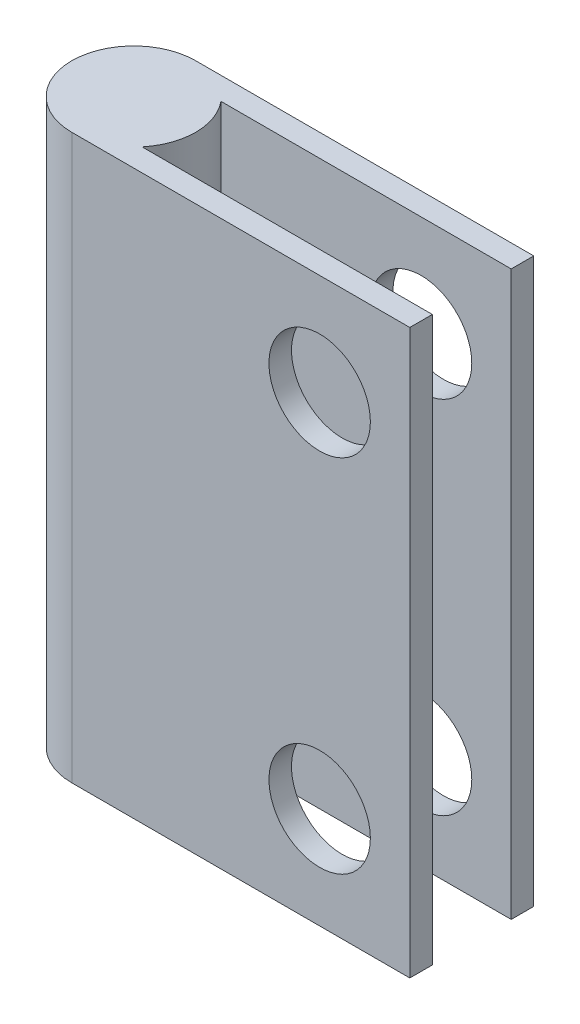
ISO-10303-21;
HEADER;
FILE_DESCRIPTION(('STEP AP214'),'2;1');
FILE_NAME('part.step','',(''),(''),'','','');
FILE_SCHEMA(('AUTOMOTIVE_DESIGN { 1 0 10303 214 1 1 1 1 }'));
ENDSEC;
DATA;
#1=APPLICATION_CONTEXT('core data for automotive mechanical design processes');
#2=APPLICATION_PROTOCOL_DEFINITION('international standard','automotive_design',2000,#1);
#3=PRODUCT_CONTEXT('',#1,'mechanical');
#4=PRODUCT('Part','Part','',(#3));
#5=PRODUCT_RELATED_PRODUCT_CATEGORY('part','',(#4));
#6=PRODUCT_DEFINITION_FORMATION('','',#4);
#7=PRODUCT_DEFINITION_CONTEXT('part definition',#1,'design');
#8=PRODUCT_DEFINITION('design','',#6,#7);
#9=PRODUCT_DEFINITION_SHAPE('','',#8);
#10=(LENGTH_UNIT() NAMED_UNIT(*) SI_UNIT(.MILLI.,.METRE.));
#11=(NAMED_UNIT(*) PLANE_ANGLE_UNIT() SI_UNIT($,.RADIAN.));
#12=(NAMED_UNIT(*) SI_UNIT($,.STERADIAN.) SOLID_ANGLE_UNIT());
#13=UNCERTAINTY_MEASURE_WITH_UNIT(LENGTH_MEASURE(1.E-05),#10,'distance_accuracy_value','');
#14=(GEOMETRIC_REPRESENTATION_CONTEXT(3) GLOBAL_UNCERTAINTY_ASSIGNED_CONTEXT((#13)) GLOBAL_UNIT_ASSIGNED_CONTEXT((#10,
#11,#12)) REPRESENTATION_CONTEXT('',''));
#15=CARTESIAN_POINT('',(0.,0.,0.));
#16=DIRECTION('',(0.,0.,1.));
#17=DIRECTION('',(1.,0.,0.));
#18=AXIS2_PLACEMENT_3D('',#15,#16,#17);
#19=CARTESIAN_POINT('',(0.,-12.5,0.));
#20=DIRECTION('',(0.,1.,0.));
#21=DIRECTION('',(1.,0.,0.));
#22=AXIS2_PLACEMENT_3D('',#19,#20,#21);
#23=PLANE('',#22);
#24=DIRECTION('',(-1.,0.,0.));
#25=VECTOR('',#24,1.);
#26=CARTESIAN_POINT('',(15.,-12.5,-2.75));
#27=LINE('',#26,#25);
#28=CARTESIAN_POINT('',(15.,-12.5,-2.75));
#29=VERTEX_POINT('',#28);
#30=CARTESIAN_POINT('',(0.,-12.5,-2.75));
#31=VERTEX_POINT('',#30);
#32=EDGE_CURVE('E126',#29,#31,#27,.T.);
#33=ORIENTED_EDGE('',*,*,#32,.F.);
#34=DIRECTION('',(0.,0.,-1.));
#35=VECTOR('',#34,1.);
#36=CARTESIAN_POINT('',(15.,-12.5,-1.75));
#37=LINE('',#36,#35);
#38=CARTESIAN_POINT('',(15.,-12.5,-1.75));
#39=VERTEX_POINT('',#38);
#40=EDGE_CURVE('E36',#39,#29,#37,.T.);
#41=ORIENTED_EDGE('',*,*,#40,.F.);
#42=DIRECTION('',(1.,0.,0.));
#43=VECTOR('',#42,1.);
#44=CARTESIAN_POINT('',(2.12132034356,-12.5,-1.75));
#45=LINE('',#44,#43);
#46=CARTESIAN_POINT('',(2.12132034356,-12.5,-1.75));
#47=VERTEX_POINT('',#46);
#48=EDGE_CURVE('E144',#47,#39,#45,.T.);
#49=ORIENTED_EDGE('',*,*,#48,.F.);
#50=CARTESIAN_POINT('',(0.,-12.5,0.));
#51=DIRECTION('',(0.,1.,0.));
#52=DIRECTION('',(0.7713892158399,0.,0.6363636363636));
#53=AXIS2_PLACEMENT_3D('',#50,#51,#52);
#54=CIRCLE('',#53,2.75);
#55=CARTESIAN_POINT('',(2.12132034356,-12.5,1.75));
#56=VERTEX_POINT('',#55);
#57=EDGE_CURVE('E152',#56,#47,#54,.T.);
#58=ORIENTED_EDGE('',*,*,#57,.F.);
#59=DIRECTION('',(-1.,0.,0.));
#60=VECTOR('',#59,1.);
#61=CARTESIAN_POINT('',(15.,-12.5,1.75));
#62=LINE('',#61,#60);
#63=CARTESIAN_POINT('',(15.,-12.5,1.75));
#64=VERTEX_POINT('',#63);
#65=EDGE_CURVE('E162',#64,#56,#62,.T.);
#66=ORIENTED_EDGE('',*,*,#65,.F.);
#67=DIRECTION('',(0.,0.,-1.));
#68=VECTOR('',#67,1.);
#69=CARTESIAN_POINT('',(15.,-12.5,2.75));
#70=LINE('',#69,#68);
#71=CARTESIAN_POINT('',(15.,-12.5,2.75));
#72=VERTEX_POINT('',#71);
#73=EDGE_CURVE('E104',#72,#64,#70,.T.);
#74=ORIENTED_EDGE('',*,*,#73,.F.);
#75=DIRECTION('',(1.,0.,0.));
#76=VECTOR('',#75,1.);
#77=CARTESIAN_POINT('',(0.,-12.5,2.75));
#78=LINE('',#77,#76);
#79=CARTESIAN_POINT('',(0.,-12.5,2.75));
#80=VERTEX_POINT('',#79);
#81=EDGE_CURVE('E102',#80,#72,#78,.T.);
#82=ORIENTED_EDGE('',*,*,#81,.F.);
#83=CARTESIAN_POINT('',(0.,-12.5,0.));
#84=DIRECTION('',(0.,1.,0.));
#85=DIRECTION('',(0.,0.,-1.));
#86=AXIS2_PLACEMENT_3D('',#83,#84,#85);
#87=CIRCLE('',#86,2.75);
#88=EDGE_CURVE('E27',#31,#80,#87,.T.);
#89=ORIENTED_EDGE('',*,*,#88,.F.);
#90=EDGE_LOOP('',(#33,#41,#49,#58,#66,#74,#82,#89));
#91=FACE_BOUND('',#90,.T.);
#92=ADVANCED_FACE('F17',(#91),#23,.F.);
#93=CARTESIAN_POINT('',(0.,-12.5,0.));
#94=DIRECTION('',(0.,1.,0.));
#95=DIRECTION('',(1.,0.,0.));
#96=AXIS2_PLACEMENT_3D('',#93,#94,#95);
#97=CYLINDRICAL_SURFACE('',#96,2.75);
#98=DIRECTION('',(0.,1.,0.));
#99=VECTOR('',#98,1.);
#100=CARTESIAN_POINT('',(0.,-12.5,2.75));
#101=LINE('',#100,#99);
#102=CARTESIAN_POINT('',(0.,12.5,2.75));
#103=VERTEX_POINT('',#102);
#104=EDGE_CURVE('E11',#80,#103,#101,.T.);
#105=ORIENTED_EDGE('',*,*,#104,.T.);
#106=CARTESIAN_POINT('',(0.,12.5,0.));
#107=DIRECTION('',(0.,1.,0.));
#108=DIRECTION('',(0.,0.,-1.));
#109=AXIS2_PLACEMENT_3D('',#106,#107,#108);
#110=CIRCLE('',#109,2.75);
#111=CARTESIAN_POINT('',(0.,12.5,-2.75));
#112=VERTEX_POINT('',#111);
#113=EDGE_CURVE('E108',#112,#103,#110,.T.);
#114=ORIENTED_EDGE('',*,*,#113,.F.);
#115=DIRECTION('',(0.,1.,0.));
#116=VECTOR('',#115,1.);
#117=CARTESIAN_POINT('',(0.,-12.5,-2.75));
#118=LINE('',#117,#116);
#119=EDGE_CURVE('E119',#31,#112,#118,.T.);
#120=ORIENTED_EDGE('',*,*,#119,.F.);
#121=ORIENTED_EDGE('',*,*,#88,.T.);
#122=EDGE_LOOP('',(#105,#114,#120,#121));
#123=FACE_BOUND('',#122,.T.);
#124=ADVANCED_FACE('F188',(#123),#97,.T.);
#125=CARTESIAN_POINT('',(15.,-12.5,-2.75));
#126=DIRECTION('',(0.,0.,-1.));
#127=DIRECTION('',(-1.,0.,0.));
#128=AXIS2_PLACEMENT_3D('',#125,#126,#127);
#129=PLANE('',#128);
#130=ORIENTED_EDGE('',*,*,#119,.T.);
#131=DIRECTION('',(-1.,0.,0.));
#132=VECTOR('',#131,1.);
#133=CARTESIAN_POINT('',(15.,12.5,-2.75));
#134=LINE('',#133,#132);
#135=CARTESIAN_POINT('',(15.,12.5,-2.75));
#136=VERTEX_POINT('',#135);
#137=EDGE_CURVE('E122',#136,#112,#134,.T.);
#138=ORIENTED_EDGE('',*,*,#137,.F.);
#139=DIRECTION('',(0.,1.,0.));
#140=VECTOR('',#139,1.);
#141=CARTESIAN_POINT('',(15.,-12.5,-2.75));
#142=LINE('',#141,#140);
#143=EDGE_CURVE('E129',#29,#136,#142,.T.);
#144=ORIENTED_EDGE('',*,*,#143,.F.);
#145=ORIENTED_EDGE('',*,*,#32,.T.);
#146=EDGE_LOOP('',(#130,#138,#144,#145));
#147=FACE_BOUND('',#146,.T.);
#148=CARTESIAN_POINT('',(11.,8.,-2.75));
#149=DIRECTION('',(0.,0.,-1.));
#150=DIRECTION('',(1.,0.,0.));
#151=AXIS2_PLACEMENT_3D('',#148,#149,#150);
#152=CIRCLE('',#151,2.25);
#153=CARTESIAN_POINT('',(13.25,8.,-2.75));
#154=VERTEX_POINT('',#153);
#155=EDGE_CURVE('E131',#154,#154,#152,.T.);
#156=ORIENTED_EDGE('',*,*,#155,.F.);
#157=EDGE_LOOP('',(#156));
#158=FACE_BOUND('',#157,.T.);
#159=CARTESIAN_POINT('',(11.,-8.,-2.75));
#160=DIRECTION('',(0.,0.,-1.));
#161=DIRECTION('',(1.,0.,0.));
#162=AXIS2_PLACEMENT_3D('',#159,#160,#161);
#163=CIRCLE('',#162,2.25);
#164=CARTESIAN_POINT('',(13.25,-8.,-2.75));
#165=VERTEX_POINT('',#164);
#166=EDGE_CURVE('E135',#165,#165,#163,.T.);
#167=ORIENTED_EDGE('',*,*,#166,.F.);
#168=EDGE_LOOP('',(#167));
#169=FACE_BOUND('',#168,.T.);
#170=ADVANCED_FACE('F194',(#147,#158,#169),#129,.T.);
#171=CARTESIAN_POINT('',(15.,-12.5,-1.75));
#172=DIRECTION('',(1.,0.,0.));
#173=DIRECTION('',(0.,0.,-1.));
#174=AXIS2_PLACEMENT_3D('',#171,#172,#173);
#175=PLANE('',#174);
#176=ORIENTED_EDGE('',*,*,#143,.T.);
#177=DIRECTION('',(0.,0.,-1.));
#178=VECTOR('',#177,1.);
#179=CARTESIAN_POINT('',(15.,12.5,-1.75));
#180=LINE('',#179,#178);
#181=CARTESIAN_POINT('',(15.,12.5,-1.75));
#182=VERTEX_POINT('',#181);
#183=EDGE_CURVE('E128',#182,#136,#180,.T.);
#184=ORIENTED_EDGE('',*,*,#183,.F.);
#185=DIRECTION('',(0.,1.,0.));
#186=VECTOR('',#185,1.);
#187=CARTESIAN_POINT('',(15.,-12.5,-1.75));
#188=LINE('',#187,#186);
#189=EDGE_CURVE('E141',#39,#182,#188,.T.);
#190=ORIENTED_EDGE('',*,*,#189,.F.);
#191=ORIENTED_EDGE('',*,*,#40,.T.);
#192=EDGE_LOOP('',(#176,#184,#190,#191));
#193=FACE_BOUND('',#192,.T.);
#194=ADVANCED_FACE('F200',(#193),#175,.T.);
#195=CARTESIAN_POINT('',(2.12132034356,-12.5,-1.75));
#196=DIRECTION('',(0.,0.,1.));
#197=DIRECTION('',(1.,0.,0.));
#198=AXIS2_PLACEMENT_3D('',#195,#196,#197);
#199=PLANE('',#198);
#200=ORIENTED_EDGE('',*,*,#189,.T.);
#201=DIRECTION('',(1.,0.,0.));
#202=VECTOR('',#201,1.);
#203=CARTESIAN_POINT('',(2.12132034356,12.5,-1.75));
#204=LINE('',#203,#202);
#205=CARTESIAN_POINT('',(2.12132034356,12.5,-1.75));
#206=VERTEX_POINT('',#205);
#207=EDGE_CURVE('E140',#206,#182,#204,.T.);
#208=ORIENTED_EDGE('',*,*,#207,.F.);
#209=DIRECTION('',(0.,1.,0.));
#210=VECTOR('',#209,1.);
#211=CARTESIAN_POINT('',(2.12132034356,-12.5,-1.75));
#212=LINE('',#211,#210);
#213=EDGE_CURVE('E148',#47,#206,#212,.T.);
#214=ORIENTED_EDGE('',*,*,#213,.F.);
#215=ORIENTED_EDGE('',*,*,#48,.T.);
#216=EDGE_LOOP('',(#200,#208,#214,#215));
#217=FACE_BOUND('',#216,.T.);
#218=CARTESIAN_POINT('',(11.,8.,-1.75));
#219=DIRECTION('',(0.,0.,-1.));
#220=DIRECTION('',(1.,0.,0.));
#221=AXIS2_PLACEMENT_3D('',#218,#219,#220);
#222=CIRCLE('',#221,2.25);
#223=CARTESIAN_POINT('',(13.25,8.,-1.75));
#224=VERTEX_POINT('',#223);
#225=EDGE_CURVE('E153',#224,#224,#222,.T.);
#226=ORIENTED_EDGE('',*,*,#225,.T.);
#227=EDGE_LOOP('',(#226));
#228=FACE_BOUND('',#227,.T.);
#229=CARTESIAN_POINT('',(11.,-8.,-1.75));
#230=DIRECTION('',(0.,0.,-1.));
#231=DIRECTION('',(1.,0.,0.));
#232=AXIS2_PLACEMENT_3D('',#229,#230,#231);
#233=CIRCLE('',#232,2.25);
#234=CARTESIAN_POINT('',(13.25,-8.,-1.75));
#235=VERTEX_POINT('',#234);
#236=EDGE_CURVE('E151',#235,#235,#233,.T.);
#237=ORIENTED_EDGE('',*,*,#236,.T.);
#238=EDGE_LOOP('',(#237));
#239=FACE_BOUND('',#238,.T.);
#240=ADVANCED_FACE('F183',(#217,#228,#239),#199,.T.);
#241=CARTESIAN_POINT('',(0.,-12.5,0.));
#242=DIRECTION('',(0.,1.,0.));
#243=DIRECTION('',(1.,0.,0.));
#244=AXIS2_PLACEMENT_3D('',#241,#242,#243);
#245=CYLINDRICAL_SURFACE('',#244,2.75);
#246=ORIENTED_EDGE('',*,*,#213,.T.);
#247=CARTESIAN_POINT('',(0.,12.5,0.));
#248=DIRECTION('',(0.,1.,0.));
#249=DIRECTION('',(0.7713892158399,0.,0.6363636363636));
#250=AXIS2_PLACEMENT_3D('',#247,#248,#249);
#251=CIRCLE('',#250,2.75);
#252=CARTESIAN_POINT('',(2.12132034356,12.5,1.75));
#253=VERTEX_POINT('',#252);
#254=EDGE_CURVE('E147',#253,#206,#251,.T.);
#255=ORIENTED_EDGE('',*,*,#254,.F.);
#256=DIRECTION('',(0.,1.,0.));
#257=VECTOR('',#256,1.);
#258=CARTESIAN_POINT('',(2.12132034356,-12.5,1.75));
#259=LINE('',#258,#257);
#260=EDGE_CURVE('E160',#56,#253,#259,.T.);
#261=ORIENTED_EDGE('',*,*,#260,.F.);
#262=ORIENTED_EDGE('',*,*,#57,.T.);
#263=EDGE_LOOP('',(#246,#255,#261,#262));
#264=FACE_BOUND('',#263,.T.);
#265=ADVANCED_FACE('F175',(#264),#245,.T.);
#266=CARTESIAN_POINT('',(15.,-12.5,1.75));
#267=DIRECTION('',(0.,0.,-1.));
#268=DIRECTION('',(-1.,0.,0.));
#269=AXIS2_PLACEMENT_3D('',#266,#267,#268);
#270=PLANE('',#269);
#271=ORIENTED_EDGE('',*,*,#260,.T.);
#272=DIRECTION('',(-1.,0.,0.));
#273=VECTOR('',#272,1.);
#274=CARTESIAN_POINT('',(15.,12.5,1.75));
#275=LINE('',#274,#273);
#276=CARTESIAN_POINT('',(15.,12.5,1.75));
#277=VERTEX_POINT('',#276);
#278=EDGE_CURVE('E82',#277,#253,#275,.T.);
#279=ORIENTED_EDGE('',*,*,#278,.F.);
#280=DIRECTION('',(0.,1.,0.));
#281=VECTOR('',#280,1.);
#282=CARTESIAN_POINT('',(15.,-12.5,1.75));
#283=LINE('',#282,#281);
#284=EDGE_CURVE('E92',#64,#277,#283,.T.);
#285=ORIENTED_EDGE('',*,*,#284,.F.);
#286=ORIENTED_EDGE('',*,*,#65,.T.);
#287=EDGE_LOOP('',(#271,#279,#285,#286));
#288=FACE_BOUND('',#287,.T.);
#289=CARTESIAN_POINT('',(11.,8.,1.75));
#290=DIRECTION('',(0.,0.,-1.));
#291=DIRECTION('',(1.,0.,0.));
#292=AXIS2_PLACEMENT_3D('',#289,#290,#291);
#293=CIRCLE('',#292,2.25);
#294=CARTESIAN_POINT('',(13.25,8.,1.75));
#295=VERTEX_POINT('',#294);
#296=EDGE_CURVE('E123',#295,#295,#293,.T.);
#297=ORIENTED_EDGE('',*,*,#296,.F.);
#298=EDGE_LOOP('',(#297));
#299=FACE_BOUND('',#298,.T.);
#300=CARTESIAN_POINT('',(11.,-8.,1.75));
#301=DIRECTION('',(0.,0.,-1.));
#302=DIRECTION('',(1.,0.,0.));
#303=AXIS2_PLACEMENT_3D('',#300,#301,#302);
#304=CIRCLE('',#303,2.25);
#305=CARTESIAN_POINT('',(13.25,-8.,1.75));
#306=VERTEX_POINT('',#305);
#307=EDGE_CURVE('E134',#306,#306,#304,.T.);
#308=ORIENTED_EDGE('',*,*,#307,.F.);
#309=EDGE_LOOP('',(#308));
#310=FACE_BOUND('',#309,.T.);
#311=ADVANCED_FACE('F173',(#288,#299,#310),#270,.T.);
#312=CARTESIAN_POINT('',(15.,-12.5,2.75));
#313=DIRECTION('',(1.,0.,0.));
#314=DIRECTION('',(0.,0.,-1.));
#315=AXIS2_PLACEMENT_3D('',#312,#313,#314);
#316=PLANE('',#315);
#317=ORIENTED_EDGE('',*,*,#284,.T.);
#318=DIRECTION('',(0.,0.,-1.));
#319=VECTOR('',#318,1.);
#320=CARTESIAN_POINT('',(15.,12.5,2.75));
#321=LINE('',#320,#319);
#322=CARTESIAN_POINT('',(15.,12.5,2.75));
#323=VERTEX_POINT('',#322);
#324=EDGE_CURVE('E88',#323,#277,#321,.T.);
#325=ORIENTED_EDGE('',*,*,#324,.F.);
#326=DIRECTION('',(0.,1.,0.));
#327=VECTOR('',#326,1.);
#328=CARTESIAN_POINT('',(15.,-12.5,2.75));
#329=LINE('',#328,#327);
#330=EDGE_CURVE('E91',#72,#323,#329,.T.);
#331=ORIENTED_EDGE('',*,*,#330,.F.);
#332=ORIENTED_EDGE('',*,*,#73,.T.);
#333=EDGE_LOOP('',(#317,#325,#331,#332));
#334=FACE_BOUND('',#333,.T.);
#335=ADVANCED_FACE('F90',(#334),#316,.T.);
#336=CARTESIAN_POINT('',(0.,-12.5,2.75));
#337=DIRECTION('',(0.,0.,1.));
#338=DIRECTION('',(1.,0.,0.));
#339=AXIS2_PLACEMENT_3D('',#336,#337,#338);
#340=PLANE('',#339);
#341=ORIENTED_EDGE('',*,*,#330,.T.);
#342=DIRECTION('',(1.,0.,0.));
#343=VECTOR('',#342,1.);
#344=CARTESIAN_POINT('',(0.,12.5,2.75));
#345=LINE('',#344,#343);
#346=EDGE_CURVE('E95',#103,#323,#345,.T.);
#347=ORIENTED_EDGE('',*,*,#346,.F.);
#348=ORIENTED_EDGE('',*,*,#104,.F.);
#349=ORIENTED_EDGE('',*,*,#81,.T.);
#350=EDGE_LOOP('',(#341,#347,#348,#349));
#351=FACE_BOUND('',#350,.T.);
#352=CARTESIAN_POINT('',(11.,8.,2.75));
#353=DIRECTION('',(0.,0.,-1.));
#354=DIRECTION('',(1.,0.,0.));
#355=AXIS2_PLACEMENT_3D('',#352,#353,#354);
#356=CIRCLE('',#355,2.25);
#357=CARTESIAN_POINT('',(13.25,8.,2.75));
#358=VERTEX_POINT('',#357);
#359=EDGE_CURVE('E111',#358,#358,#356,.T.);
#360=ORIENTED_EDGE('',*,*,#359,.T.);
#361=EDGE_LOOP('',(#360));
#362=FACE_BOUND('',#361,.T.);
#363=CARTESIAN_POINT('',(11.,-8.,2.75));
#364=DIRECTION('',(0.,0.,-1.));
#365=DIRECTION('',(1.,0.,0.));
#366=AXIS2_PLACEMENT_3D('',#363,#364,#365);
#367=CIRCLE('',#366,2.25);
#368=CARTESIAN_POINT('',(13.25,-8.,2.75));
#369=VERTEX_POINT('',#368);
#370=EDGE_CURVE('E21',#369,#369,#367,.T.);
#371=ORIENTED_EDGE('',*,*,#370,.T.);
#372=EDGE_LOOP('',(#371));
#373=FACE_BOUND('',#372,.T.);
#374=ADVANCED_FACE('F99',(#351,#362,#373),#340,.T.);
#375=CARTESIAN_POINT('',(0.,12.5,0.));
#376=DIRECTION('',(0.,1.,0.));
#377=DIRECTION('',(1.,0.,0.));
#378=AXIS2_PLACEMENT_3D('',#375,#376,#377);
#379=PLANE('',#378);
#380=ORIENTED_EDGE('',*,*,#346,.T.);
#381=ORIENTED_EDGE('',*,*,#324,.T.);
#382=ORIENTED_EDGE('',*,*,#278,.T.);
#383=ORIENTED_EDGE('',*,*,#254,.T.);
#384=ORIENTED_EDGE('',*,*,#207,.T.);
#385=ORIENTED_EDGE('',*,*,#183,.T.);
#386=ORIENTED_EDGE('',*,*,#137,.T.);
#387=ORIENTED_EDGE('',*,*,#113,.T.);
#388=EDGE_LOOP('',(#380,#381,#382,#383,#384,#385,#386,#387));
#389=FACE_BOUND('',#388,.T.);
#390=ADVANCED_FACE('F106',(#389),#379,.T.);
#391=CARTESIAN_POINT('',(11.,8.,2.75));
#392=DIRECTION('',(0.,0.,-1.));
#393=DIRECTION('',(-1.,0.,0.));
#394=AXIS2_PLACEMENT_3D('',#391,#392,#393);
#395=CYLINDRICAL_SURFACE('',#394,2.25);
#396=ORIENTED_EDGE('',*,*,#296,.T.);
#397=EDGE_LOOP('',(#396));
#398=FACE_BOUND('',#397,.T.);
#399=ORIENTED_EDGE('',*,*,#359,.F.);
#400=EDGE_LOOP('',(#399));
#401=FACE_BOUND('',#400,.T.);
#402=ADVANCED_FACE('F224',(#398,#401),#395,.F.);
#403=CARTESIAN_POINT('',(11.,8.,2.75));
#404=DIRECTION('',(0.,0.,-1.));
#405=DIRECTION('',(-1.,0.,0.));
#406=AXIS2_PLACEMENT_3D('',#403,#404,#405);
#407=CYLINDRICAL_SURFACE('',#406,2.25);
#408=ORIENTED_EDGE('',*,*,#155,.T.);
#409=EDGE_LOOP('',(#408));
#410=FACE_BOUND('',#409,.T.);
#411=ORIENTED_EDGE('',*,*,#225,.F.);
#412=EDGE_LOOP('',(#411));
#413=FACE_BOUND('',#412,.T.);
#414=ADVANCED_FACE('F218',(#410,#413),#407,.F.);
#415=CARTESIAN_POINT('',(11.,-8.,2.75));
#416=DIRECTION('',(0.,0.,-1.));
#417=DIRECTION('',(-1.,0.,0.));
#418=AXIS2_PLACEMENT_3D('',#415,#416,#417);
#419=CYLINDRICAL_SURFACE('',#418,2.25);
#420=ORIENTED_EDGE('',*,*,#307,.T.);
#421=EDGE_LOOP('',(#420));
#422=FACE_BOUND('',#421,.T.);
#423=ORIENTED_EDGE('',*,*,#370,.F.);
#424=EDGE_LOOP('',(#423));
#425=FACE_BOUND('',#424,.T.);
#426=ADVANCED_FACE('F170',(#422,#425),#419,.F.);
#427=CARTESIAN_POINT('',(11.,-8.,2.75));
#428=DIRECTION('',(0.,0.,-1.));
#429=DIRECTION('',(-1.,0.,0.));
#430=AXIS2_PLACEMENT_3D('',#427,#428,#429);
#431=CYLINDRICAL_SURFACE('',#430,2.25);
#432=ORIENTED_EDGE('',*,*,#166,.T.);
#433=EDGE_LOOP('',(#432));
#434=FACE_BOUND('',#433,.T.);
#435=ORIENTED_EDGE('',*,*,#236,.F.);
#436=EDGE_LOOP('',(#435));
#437=FACE_BOUND('',#436,.T.);
#438=ADVANCED_FACE('F19',(#434,#437),#431,.F.);
#439=CLOSED_SHELL('',(#92,#124,#170,#194,#240,#265,#311,#335,#374,#390,#402,#414,#426,#438));
#440=MANIFOLD_SOLID_BREP('B1',#439);
#441=ADVANCED_BREP_SHAPE_REPRESENTATION('',(#18,#440),#14);
#442=SHAPE_DEFINITION_REPRESENTATION(#9,#441);
ENDSEC;
END-ISO-10303-21;
